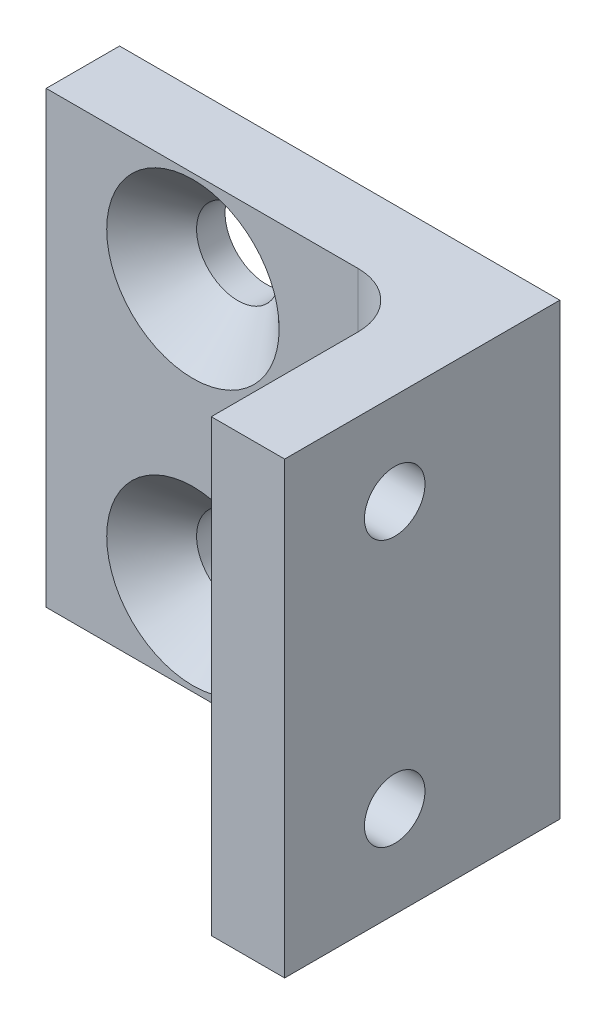
ISO-10303-21;
HEADER;
FILE_DESCRIPTION(('STEP AP214'),'2;1');
FILE_NAME('part.step','',(''),(''),'','','');
FILE_SCHEMA(('AUTOMOTIVE_DESIGN { 1 0 10303 214 1 1 1 1 }'));
ENDSEC;
DATA;
#1=APPLICATION_CONTEXT('core data for automotive mechanical design processes');
#2=APPLICATION_PROTOCOL_DEFINITION('international standard','automotive_design',2000,#1);
#3=PRODUCT_CONTEXT('',#1,'mechanical');
#4=PRODUCT('Part','Part','',(#3));
#5=PRODUCT_RELATED_PRODUCT_CATEGORY('part','',(#4));
#6=PRODUCT_DEFINITION_FORMATION('','',#4);
#7=PRODUCT_DEFINITION_CONTEXT('part definition',#1,'design');
#8=PRODUCT_DEFINITION('design','',#6,#7);
#9=PRODUCT_DEFINITION_SHAPE('','',#8);
#10=(LENGTH_UNIT() NAMED_UNIT(*) SI_UNIT(.MILLI.,.METRE.));
#11=(NAMED_UNIT(*) PLANE_ANGLE_UNIT() SI_UNIT($,.RADIAN.));
#12=(NAMED_UNIT(*) SI_UNIT($,.STERADIAN.) SOLID_ANGLE_UNIT());
#13=UNCERTAINTY_MEASURE_WITH_UNIT(LENGTH_MEASURE(1.E-05),#10,'distance_accuracy_value','');
#14=(GEOMETRIC_REPRESENTATION_CONTEXT(3) GLOBAL_UNCERTAINTY_ASSIGNED_CONTEXT((#13)) GLOBAL_UNIT_ASSIGNED_CONTEXT((#10,
#11,#12)) REPRESENTATION_CONTEXT('',''));
#15=CARTESIAN_POINT('',(0.,0.,0.));
#16=DIRECTION('',(0.,0.,1.));
#17=DIRECTION('',(1.,0.,0.));
#18=AXIS2_PLACEMENT_3D('',#15,#16,#17);
#19=CARTESIAN_POINT('',(0.,24.5,15.));
#20=DIRECTION('',(-1.,0.,0.));
#21=DIRECTION('',(0.,0.,1.));
#22=AXIS2_PLACEMENT_3D('',#19,#20,#21);
#23=PLANE('',#22);
#24=CARTESIAN_POINT('',(0.,19.5,9.));
#25=DIRECTION('',(-1.,0.,0.));
#26=DIRECTION('',(0.,0.,1.));
#27=AXIS2_PLACEMENT_3D('',#24,#25,#26);
#28=CIRCLE('',#27,1.65);
#29=CARTESIAN_POINT('',(0.,19.5,10.65));
#30=VERTEX_POINT('',#29);
#31=EDGE_CURVE('E211',#30,#30,#28,.T.);
#32=ORIENTED_EDGE('',*,*,#31,.T.);
#33=EDGE_LOOP('',(#32));
#34=FACE_BOUND('',#33,.T.);
#35=CARTESIAN_POINT('',(0.,5.,9.));
#36=DIRECTION('',(-1.,0.,0.));
#37=DIRECTION('',(0.,0.,1.));
#38=AXIS2_PLACEMENT_3D('',#35,#36,#37);
#39=CIRCLE('',#38,1.65);
#40=CARTESIAN_POINT('',(0.,5.,10.65));
#41=VERTEX_POINT('',#40);
#42=EDGE_CURVE('E201',#41,#41,#39,.T.);
#43=ORIENTED_EDGE('',*,*,#42,.T.);
#44=EDGE_LOOP('',(#43));
#45=FACE_BOUND('',#44,.T.);
#46=DIRECTION('',(0.,0.,-1.));
#47=VECTOR('',#46,1.);
#48=CARTESIAN_POINT('',(0.,0.,15.));
#49=LINE('',#48,#47);
#50=CARTESIAN_POINT('',(0.,0.,15.));
#51=VERTEX_POINT('',#50);
#52=CARTESIAN_POINT('',(0.,0.,0.));
#53=VERTEX_POINT('',#52);
#54=EDGE_CURVE('E129',#51,#53,#49,.T.);
#55=ORIENTED_EDGE('',*,*,#54,.T.);
#56=DIRECTION('',(0.,-1.,0.));
#57=VECTOR('',#56,1.);
#58=CARTESIAN_POINT('',(0.,24.5,0.));
#59=LINE('',#58,#57);
#60=CARTESIAN_POINT('',(0.,24.5,0.));
#61=VERTEX_POINT('',#60);
#62=EDGE_CURVE('E107',#61,#53,#59,.T.);
#63=ORIENTED_EDGE('',*,*,#62,.F.);
#64=DIRECTION('',(0.,0.,-1.));
#65=VECTOR('',#64,1.);
#66=CARTESIAN_POINT('',(0.,24.5,15.));
#67=LINE('',#66,#65);
#68=CARTESIAN_POINT('',(0.,24.5,15.));
#69=VERTEX_POINT('',#68);
#70=EDGE_CURVE('E119',#69,#61,#67,.T.);
#71=ORIENTED_EDGE('',*,*,#70,.F.);
#72=DIRECTION('',(0.,-1.,0.));
#73=VECTOR('',#72,1.);
#74=CARTESIAN_POINT('',(0.,24.5,15.));
#75=LINE('',#74,#73);
#76=EDGE_CURVE('E147',#69,#51,#75,.T.);
#77=ORIENTED_EDGE('',*,*,#76,.T.);
#78=EDGE_LOOP('',(#55,#63,#71,#77));
#79=FACE_BOUND('',#78,.T.);
#80=ADVANCED_FACE('F42',(#34,#45,#79),#23,.F.);
#81=CARTESIAN_POINT('',(0.,24.5,0.));
#82=DIRECTION('',(0.,0.,1.));
#83=DIRECTION('',(1.,0.,0.));
#84=AXIS2_PLACEMENT_3D('',#81,#82,#83);
#85=PLANE('',#84);
#86=CARTESIAN_POINT('',(-16.,19.5,0.));
#87=DIRECTION('',(0.,0.,1.));
#88=DIRECTION('',(1.,0.,0.));
#89=AXIS2_PLACEMENT_3D('',#86,#87,#88);
#90=CIRCLE('',#89,2.25);
#91=CARTESIAN_POINT('',(-13.75,19.5,0.));
#92=VERTEX_POINT('',#91);
#93=EDGE_CURVE('E194',#92,#92,#90,.T.);
#94=ORIENTED_EDGE('',*,*,#93,.T.);
#95=EDGE_LOOP('',(#94));
#96=FACE_BOUND('',#95,.T.);
#97=CARTESIAN_POINT('',(-16.,5.,0.));
#98=DIRECTION('',(0.,0.,1.));
#99=DIRECTION('',(1.,0.,0.));
#100=AXIS2_PLACEMENT_3D('',#97,#98,#99);
#101=CIRCLE('',#100,2.25);
#102=CARTESIAN_POINT('',(-13.75,5.,0.));
#103=VERTEX_POINT('',#102);
#104=EDGE_CURVE('E166',#103,#103,#101,.T.);
#105=ORIENTED_EDGE('',*,*,#104,.T.);
#106=EDGE_LOOP('',(#105));
#107=FACE_BOUND('',#106,.T.);
#108=DIRECTION('',(-1.,0.,0.));
#109=VECTOR('',#108,1.);
#110=CARTESIAN_POINT('',(0.,0.,0.));
#111=LINE('',#110,#109);
#112=CARTESIAN_POINT('',(-24.,0.,0.));
#113=VERTEX_POINT('',#112);
#114=EDGE_CURVE('E163',#53,#113,#111,.T.);
#115=ORIENTED_EDGE('',*,*,#114,.T.);
#116=DIRECTION('',(0.,-1.,0.));
#117=VECTOR('',#116,1.);
#118=CARTESIAN_POINT('',(-24.,24.5,0.));
#119=LINE('',#118,#117);
#120=CARTESIAN_POINT('',(-24.,24.5,0.));
#121=VERTEX_POINT('',#120);
#122=EDGE_CURVE('E112',#121,#113,#119,.T.);
#123=ORIENTED_EDGE('',*,*,#122,.F.);
#124=DIRECTION('',(-1.,0.,0.));
#125=VECTOR('',#124,1.);
#126=CARTESIAN_POINT('',(0.,24.5,0.));
#127=LINE('',#126,#125);
#128=EDGE_CURVE('E102',#61,#121,#127,.T.);
#129=ORIENTED_EDGE('',*,*,#128,.F.);
#130=ORIENTED_EDGE('',*,*,#62,.T.);
#131=EDGE_LOOP('',(#115,#123,#129,#130));
#132=FACE_BOUND('',#131,.T.);
#133=ADVANCED_FACE('F106',(#96,#107,#132),#85,.F.);
#134=CARTESIAN_POINT('',(-24.,24.5,0.));
#135=DIRECTION('',(1.,0.,0.));
#136=DIRECTION('',(0.,0.,-1.));
#137=AXIS2_PLACEMENT_3D('',#134,#135,#136);
#138=PLANE('',#137);
#139=DIRECTION('',(0.,0.,1.));
#140=VECTOR('',#139,1.);
#141=CARTESIAN_POINT('',(-24.,0.,0.));
#142=LINE('',#141,#140);
#143=CARTESIAN_POINT('',(-24.,0.,4.));
#144=VERTEX_POINT('',#143);
#145=EDGE_CURVE('E161',#113,#144,#142,.T.);
#146=ORIENTED_EDGE('',*,*,#145,.T.);
#147=DIRECTION('',(0.,-1.,0.));
#148=VECTOR('',#147,1.);
#149=CARTESIAN_POINT('',(-24.,24.5,4.));
#150=LINE('',#149,#148);
#151=CARTESIAN_POINT('',(-24.,24.5,4.));
#152=VERTEX_POINT('',#151);
#153=EDGE_CURVE('E136',#152,#144,#150,.T.);
#154=ORIENTED_EDGE('',*,*,#153,.F.);
#155=DIRECTION('',(0.,0.,1.));
#156=VECTOR('',#155,1.);
#157=CARTESIAN_POINT('',(-24.,24.5,0.));
#158=LINE('',#157,#156);
#159=EDGE_CURVE('E113',#121,#152,#158,.T.);
#160=ORIENTED_EDGE('',*,*,#159,.F.);
#161=ORIENTED_EDGE('',*,*,#122,.T.);
#162=EDGE_LOOP('',(#146,#154,#160,#161));
#163=FACE_BOUND('',#162,.T.);
#164=ADVANCED_FACE('F239',(#163),#138,.F.);
#165=CARTESIAN_POINT('',(-24.,24.5,4.));
#166=DIRECTION('',(0.,0.,-1.));
#167=DIRECTION('',(-1.,0.,0.));
#168=AXIS2_PLACEMENT_3D('',#165,#166,#167);
#169=PLANE('',#168);
#170=CARTESIAN_POINT('',(-16.,19.5,4.));
#171=DIRECTION('',(0.,0.,1.));
#172=DIRECTION('',(1.,0.,0.));
#173=AXIS2_PLACEMENT_3D('',#170,#171,#172);
#174=CIRCLE('',#173,4.7);
#175=CARTESIAN_POINT('',(-11.3,19.5,4.));
#176=VERTEX_POINT('',#175);
#177=EDGE_CURVE('E200',#176,#176,#174,.T.);
#178=ORIENTED_EDGE('',*,*,#177,.F.);
#179=EDGE_LOOP('',(#178));
#180=FACE_BOUND('',#179,.T.);
#181=CARTESIAN_POINT('',(-16.,5.,4.));
#182=DIRECTION('',(0.,0.,1.));
#183=DIRECTION('',(1.,0.,0.));
#184=AXIS2_PLACEMENT_3D('',#181,#182,#183);
#185=CIRCLE('',#184,4.7);
#186=CARTESIAN_POINT('',(-11.3,5.,4.));
#187=VERTEX_POINT('',#186);
#188=EDGE_CURVE('E186',#187,#187,#185,.T.);
#189=ORIENTED_EDGE('',*,*,#188,.F.);
#190=EDGE_LOOP('',(#189));
#191=FACE_BOUND('',#190,.T.);
#192=DIRECTION('',(1.,0.,0.));
#193=VECTOR('',#192,1.);
#194=CARTESIAN_POINT('',(-24.,0.,4.));
#195=LINE('',#194,#193);
#196=CARTESIAN_POINT('',(-7.,0.,4.));
#197=VERTEX_POINT('',#196);
#198=EDGE_CURVE('E158',#144,#197,#195,.T.);
#199=ORIENTED_EDGE('',*,*,#198,.T.);
#200=DIRECTION('',(0.,-1.,0.));
#201=VECTOR('',#200,1.);
#202=CARTESIAN_POINT('',(-7.,24.5,4.));
#203=LINE('',#202,#201);
#204=CARTESIAN_POINT('',(-7.,24.5,4.));
#205=VERTEX_POINT('',#204);
#206=EDGE_CURVE('E58',#197,#205,#203,.F.);
#207=ORIENTED_EDGE('',*,*,#206,.T.);
#208=DIRECTION('',(1.,0.,0.));
#209=VECTOR('',#208,1.);
#210=CARTESIAN_POINT('',(-24.,24.5,4.));
#211=LINE('',#210,#209);
#212=EDGE_CURVE('E172',#152,#205,#211,.T.);
#213=ORIENTED_EDGE('',*,*,#212,.F.);
#214=ORIENTED_EDGE('',*,*,#153,.T.);
#215=EDGE_LOOP('',(#199,#207,#213,#214));
#216=FACE_BOUND('',#215,.T.);
#217=ADVANCED_FACE('F229',(#180,#191,#216),#169,.F.);
#218=CARTESIAN_POINT('',(-4.,24.5,4.));
#219=DIRECTION('',(1.,0.,0.));
#220=DIRECTION('',(0.,0.,-1.));
#221=AXIS2_PLACEMENT_3D('',#218,#219,#220);
#222=PLANE('',#221);
#223=CARTESIAN_POINT('',(-4.,19.5,9.));
#224=DIRECTION('',(-1.,0.,0.));
#225=DIRECTION('',(0.,0.,1.));
#226=AXIS2_PLACEMENT_3D('',#223,#224,#225);
#227=CIRCLE('',#226,1.65);
#228=CARTESIAN_POINT('',(-4.,19.5,10.65));
#229=VERTEX_POINT('',#228);
#230=EDGE_CURVE('E214',#229,#229,#227,.T.);
#231=ORIENTED_EDGE('',*,*,#230,.F.);
#232=EDGE_LOOP('',(#231));
#233=FACE_BOUND('',#232,.T.);
#234=CARTESIAN_POINT('',(-4.,5.,9.));
#235=DIRECTION('',(-1.,0.,0.));
#236=DIRECTION('',(0.,0.,1.));
#237=AXIS2_PLACEMENT_3D('',#234,#235,#236);
#238=CIRCLE('',#237,1.65);
#239=CARTESIAN_POINT('',(-4.,5.,10.65));
#240=VERTEX_POINT('',#239);
#241=EDGE_CURVE('E210',#240,#240,#238,.T.);
#242=ORIENTED_EDGE('',*,*,#241,.F.);
#243=EDGE_LOOP('',(#242));
#244=FACE_BOUND('',#243,.T.);
#245=DIRECTION('',(0.,0.,1.));
#246=VECTOR('',#245,1.);
#247=CARTESIAN_POINT('',(-4.,24.5,4.));
#248=LINE('',#247,#246);
#249=CARTESIAN_POINT('',(-4.,24.5,7.));
#250=VERTEX_POINT('',#249);
#251=CARTESIAN_POINT('',(-4.,24.5,15.));
#252=VERTEX_POINT('',#251);
#253=EDGE_CURVE('E171',#250,#252,#248,.T.);
#254=ORIENTED_EDGE('',*,*,#253,.F.);
#255=DIRECTION('',(0.,-1.,0.));
#256=VECTOR('',#255,1.);
#257=CARTESIAN_POINT('',(-4.,0.,7.));
#258=LINE('',#257,#256);
#259=CARTESIAN_POINT('',(-4.,0.,7.));
#260=VERTEX_POINT('',#259);
#261=EDGE_CURVE('E134',#250,#260,#258,.T.);
#262=ORIENTED_EDGE('',*,*,#261,.T.);
#263=DIRECTION('',(0.,0.,1.));
#264=VECTOR('',#263,1.);
#265=CARTESIAN_POINT('',(-4.,0.,4.));
#266=LINE('',#265,#264);
#267=CARTESIAN_POINT('',(-4.,0.,15.));
#268=VERTEX_POINT('',#267);
#269=EDGE_CURVE('E154',#260,#268,#266,.T.);
#270=ORIENTED_EDGE('',*,*,#269,.T.);
#271=DIRECTION('',(0.,-1.,0.));
#272=VECTOR('',#271,1.);
#273=CARTESIAN_POINT('',(-4.,24.5,15.));
#274=LINE('',#273,#272);
#275=EDGE_CURVE('E148',#252,#268,#274,.T.);
#276=ORIENTED_EDGE('',*,*,#275,.F.);
#277=EDGE_LOOP('',(#254,#262,#270,#276));
#278=FACE_BOUND('',#277,.T.);
#279=ADVANCED_FACE('F225',(#233,#244,#278),#222,.F.);
#280=CARTESIAN_POINT('',(-4.,24.5,15.));
#281=DIRECTION('',(0.,0.,-1.));
#282=DIRECTION('',(-1.,0.,0.));
#283=AXIS2_PLACEMENT_3D('',#280,#281,#282);
#284=PLANE('',#283);
#285=DIRECTION('',(1.,0.,0.));
#286=VECTOR('',#285,1.);
#287=CARTESIAN_POINT('',(-4.,0.,15.));
#288=LINE('',#287,#286);
#289=EDGE_CURVE('E127',#268,#51,#288,.T.);
#290=ORIENTED_EDGE('',*,*,#289,.T.);
#291=ORIENTED_EDGE('',*,*,#76,.F.);
#292=DIRECTION('',(1.,0.,0.));
#293=VECTOR('',#292,1.);
#294=CARTESIAN_POINT('',(-4.,24.5,15.));
#295=LINE('',#294,#293);
#296=EDGE_CURVE('E124',#252,#69,#295,.T.);
#297=ORIENTED_EDGE('',*,*,#296,.F.);
#298=ORIENTED_EDGE('',*,*,#275,.T.);
#299=EDGE_LOOP('',(#290,#291,#297,#298));
#300=FACE_BOUND('',#299,.T.);
#301=ADVANCED_FACE('F223',(#300),#284,.F.);
#302=CARTESIAN_POINT('',(0.,24.5,0.));
#303=DIRECTION('',(0.,1.,0.));
#304=DIRECTION('',(0.,0.,1.));
#305=AXIS2_PLACEMENT_3D('',#302,#303,#304);
#306=PLANE('',#305);
#307=ORIENTED_EDGE('',*,*,#70,.T.);
#308=ORIENTED_EDGE('',*,*,#128,.T.);
#309=ORIENTED_EDGE('',*,*,#159,.T.);
#310=ORIENTED_EDGE('',*,*,#212,.T.);
#311=CARTESIAN_POINT('',(-7.,24.5,7.));
#312=DIRECTION('',(0.,1.,0.));
#313=DIRECTION('',(0.,0.,1.));
#314=AXIS2_PLACEMENT_3D('',#311,#312,#313);
#315=CIRCLE('',#314,3.);
#316=EDGE_CURVE('E11',#205,#250,#315,.F.);
#317=ORIENTED_EDGE('',*,*,#316,.T.);
#318=ORIENTED_EDGE('',*,*,#253,.T.);
#319=ORIENTED_EDGE('',*,*,#296,.T.);
#320=EDGE_LOOP('',(#307,#308,#309,#310,#317,#318,#319));
#321=FACE_BOUND('',#320,.T.);
#322=ADVANCED_FACE('F118',(#321),#306,.T.);
#323=CARTESIAN_POINT('',(0.,0.,0.));
#324=DIRECTION('',(0.,1.,0.));
#325=DIRECTION('',(0.,0.,1.));
#326=AXIS2_PLACEMENT_3D('',#323,#324,#325);
#327=PLANE('',#326);
#328=ORIENTED_EDGE('',*,*,#54,.F.);
#329=ORIENTED_EDGE('',*,*,#289,.F.);
#330=ORIENTED_EDGE('',*,*,#269,.F.);
#331=CARTESIAN_POINT('',(-7.,0.,7.));
#332=DIRECTION('',(0.,1.,0.));
#333=DIRECTION('',(0.,0.,1.));
#334=AXIS2_PLACEMENT_3D('',#331,#332,#333);
#335=CIRCLE('',#334,3.);
#336=EDGE_CURVE('E52',#260,#197,#335,.T.);
#337=ORIENTED_EDGE('',*,*,#336,.T.);
#338=ORIENTED_EDGE('',*,*,#198,.F.);
#339=ORIENTED_EDGE('',*,*,#145,.F.);
#340=ORIENTED_EDGE('',*,*,#114,.F.);
#341=EDGE_LOOP('',(#328,#329,#330,#337,#338,#339,#340));
#342=FACE_BOUND('',#341,.T.);
#343=ADVANCED_FACE('F236',(#342),#327,.F.);
#344=CARTESIAN_POINT('',(-16.,5.,4.));
#345=DIRECTION('',(0.,0.,1.));
#346=DIRECTION('',(1.,0.,0.));
#347=AXIS2_PLACEMENT_3D('',#344,#345,#346);
#348=CYLINDRICAL_SURFACE('',#347,2.25);
#349=ORIENTED_EDGE('',*,*,#104,.F.);
#350=EDGE_LOOP('',(#349));
#351=FACE_BOUND('',#350,.T.);
#352=CARTESIAN_POINT('',(-16.,5.,1.55));
#353=DIRECTION('',(0.,0.,1.));
#354=DIRECTION('',(1.,0.,0.));
#355=AXIS2_PLACEMENT_3D('',#352,#353,#354);
#356=CIRCLE('',#355,2.25);
#357=CARTESIAN_POINT('',(-13.75,5.,1.55));
#358=VERTEX_POINT('',#357);
#359=EDGE_CURVE('E181',#358,#358,#356,.T.);
#360=ORIENTED_EDGE('',*,*,#359,.T.);
#361=EDGE_LOOP('',(#360));
#362=FACE_BOUND('',#361,.T.);
#363=ADVANCED_FACE('F278',(#351,#362),#348,.F.);
#364=CARTESIAN_POINT('',(-16.,5.,4.));
#365=DIRECTION('',(0.,0.,1.));
#366=DIRECTION('',(1.,0.,0.));
#367=AXIS2_PLACEMENT_3D('',#364,#365,#366);
#368=CONICAL_SURFACE('',#367,4.7,0.785398163397448);
#369=ORIENTED_EDGE('',*,*,#359,.F.);
#370=EDGE_LOOP('',(#369));
#371=FACE_BOUND('',#370,.T.);
#372=ORIENTED_EDGE('',*,*,#188,.T.);
#373=EDGE_LOOP('',(#372));
#374=FACE_BOUND('',#373,.T.);
#375=ADVANCED_FACE('F277',(#371,#374),#368,.F.);
#376=CARTESIAN_POINT('',(-16.,19.5,4.));
#377=DIRECTION('',(0.,0.,1.));
#378=DIRECTION('',(1.,0.,0.));
#379=AXIS2_PLACEMENT_3D('',#376,#377,#378);
#380=CYLINDRICAL_SURFACE('',#379,2.25);
#381=ORIENTED_EDGE('',*,*,#93,.F.);
#382=EDGE_LOOP('',(#381));
#383=FACE_BOUND('',#382,.T.);
#384=CARTESIAN_POINT('',(-16.,19.5,1.55));
#385=DIRECTION('',(0.,0.,1.));
#386=DIRECTION('',(1.,0.,0.));
#387=AXIS2_PLACEMENT_3D('',#384,#385,#386);
#388=CIRCLE('',#387,2.25);
#389=CARTESIAN_POINT('',(-13.75,19.5,1.55));
#390=VERTEX_POINT('',#389);
#391=EDGE_CURVE('E192',#390,#390,#388,.T.);
#392=ORIENTED_EDGE('',*,*,#391,.T.);
#393=EDGE_LOOP('',(#392));
#394=FACE_BOUND('',#393,.T.);
#395=ADVANCED_FACE('F269',(#383,#394),#380,.F.);
#396=CARTESIAN_POINT('',(-16.,19.5,4.));
#397=DIRECTION('',(0.,0.,1.));
#398=DIRECTION('',(1.,0.,0.));
#399=AXIS2_PLACEMENT_3D('',#396,#397,#398);
#400=CONICAL_SURFACE('',#399,4.7,0.785398163397448);
#401=ORIENTED_EDGE('',*,*,#391,.F.);
#402=EDGE_LOOP('',(#401));
#403=FACE_BOUND('',#402,.T.);
#404=ORIENTED_EDGE('',*,*,#177,.T.);
#405=EDGE_LOOP('',(#404));
#406=FACE_BOUND('',#405,.T.);
#407=ADVANCED_FACE('F263',(#403,#406),#400,.F.);
#408=CARTESIAN_POINT('',(-4.,5.,9.));
#409=DIRECTION('',(-1.,0.,0.));
#410=DIRECTION('',(0.,0.,1.));
#411=AXIS2_PLACEMENT_3D('',#408,#409,#410);
#412=CYLINDRICAL_SURFACE('',#411,1.65);
#413=ORIENTED_EDGE('',*,*,#42,.F.);
#414=EDGE_LOOP('',(#413));
#415=FACE_BOUND('',#414,.T.);
#416=ORIENTED_EDGE('',*,*,#241,.T.);
#417=EDGE_LOOP('',(#416));
#418=FACE_BOUND('',#417,.T.);
#419=ADVANCED_FACE('F261',(#415,#418),#412,.F.);
#420=CARTESIAN_POINT('',(-4.,19.5,9.));
#421=DIRECTION('',(-1.,0.,0.));
#422=DIRECTION('',(0.,0.,1.));
#423=AXIS2_PLACEMENT_3D('',#420,#421,#422);
#424=CYLINDRICAL_SURFACE('',#423,1.65);
#425=ORIENTED_EDGE('',*,*,#31,.F.);
#426=EDGE_LOOP('',(#425));
#427=FACE_BOUND('',#426,.T.);
#428=ORIENTED_EDGE('',*,*,#230,.T.);
#429=EDGE_LOOP('',(#428));
#430=FACE_BOUND('',#429,.T.);
#431=ADVANCED_FACE('F219',(#427,#430),#424,.F.);
#432=CARTESIAN_POINT('',(-7.,24.5,7.));
#433=DIRECTION('',(0.,1.,0.));
#434=DIRECTION('',(0.,0.,1.));
#435=AXIS2_PLACEMENT_3D('',#432,#433,#434);
#436=CYLINDRICAL_SURFACE('',#435,3.);
#437=ORIENTED_EDGE('',*,*,#316,.F.);
#438=ORIENTED_EDGE('',*,*,#206,.F.);
#439=ORIENTED_EDGE('',*,*,#336,.F.);
#440=ORIENTED_EDGE('',*,*,#261,.F.);
#441=EDGE_LOOP('',(#437,#438,#439,#440));
#442=FACE_BOUND('',#441,.T.);
#443=ADVANCED_FACE('F46',(#442),#436,.F.);
#444=CLOSED_SHELL('',(#80,#133,#164,#217,#279,#301,#322,#343,#363,#375,#395,#407,#419,#431,#443));
#445=MANIFOLD_SOLID_BREP('B2',#444);
#446=ADVANCED_BREP_SHAPE_REPRESENTATION('',(#18,#445),#14);
#447=SHAPE_DEFINITION_REPRESENTATION(#9,#446);
ENDSEC;
END-ISO-10303-21;
